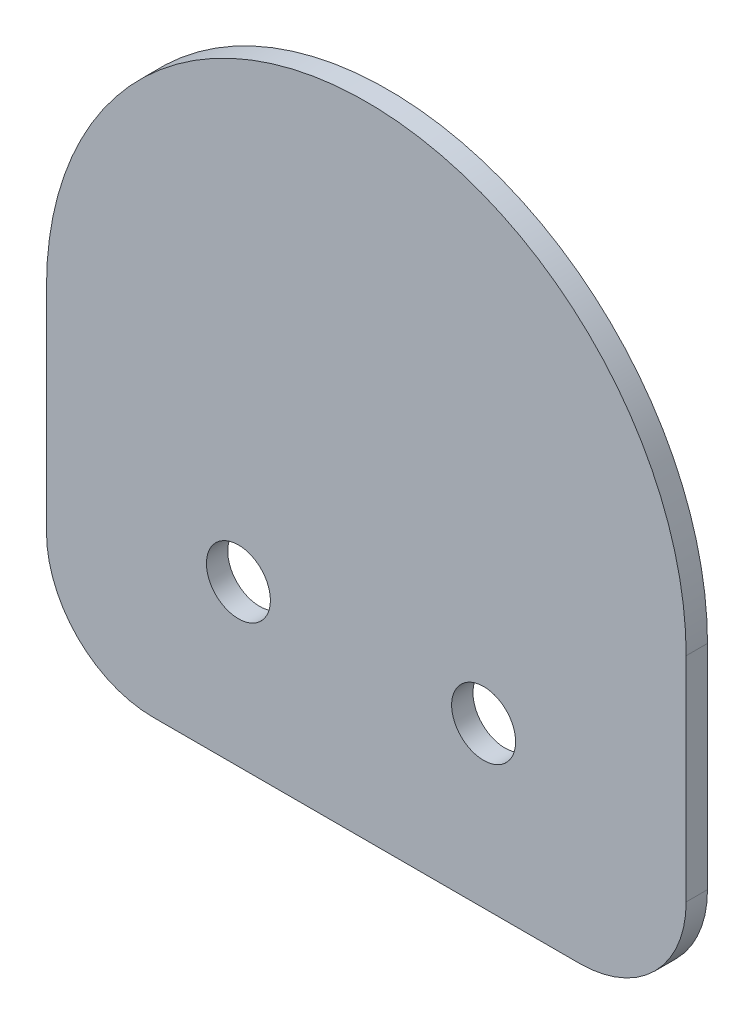
ISO-10303-21;
HEADER;
FILE_DESCRIPTION(('STEP AP214'),'2;1');
FILE_NAME('part.step','',(''),(''),'','','');
FILE_SCHEMA(('AUTOMOTIVE_DESIGN { 1 0 10303 214 1 1 1 1 }'));
ENDSEC;
DATA;
#1=APPLICATION_CONTEXT('core data for automotive mechanical design processes');
#2=APPLICATION_PROTOCOL_DEFINITION('international standard','automotive_design',2000,#1);
#3=PRODUCT_CONTEXT('',#1,'mechanical');
#4=PRODUCT('Part','Part','',(#3));
#5=PRODUCT_RELATED_PRODUCT_CATEGORY('part','',(#4));
#6=PRODUCT_DEFINITION_FORMATION('','',#4);
#7=PRODUCT_DEFINITION_CONTEXT('part definition',#1,'design');
#8=PRODUCT_DEFINITION('design','',#6,#7);
#9=PRODUCT_DEFINITION_SHAPE('','',#8);
#10=(LENGTH_UNIT() NAMED_UNIT(*) SI_UNIT(.MILLI.,.METRE.));
#11=(NAMED_UNIT(*) PLANE_ANGLE_UNIT() SI_UNIT($,.RADIAN.));
#12=(NAMED_UNIT(*) SI_UNIT($,.STERADIAN.) SOLID_ANGLE_UNIT());
#13=UNCERTAINTY_MEASURE_WITH_UNIT(LENGTH_MEASURE(1.E-05),#10,'distance_accuracy_value','');
#14=(GEOMETRIC_REPRESENTATION_CONTEXT(3) GLOBAL_UNCERTAINTY_ASSIGNED_CONTEXT((#13)) GLOBAL_UNIT_ASSIGNED_CONTEXT((#10,
#11,#12)) REPRESENTATION_CONTEXT('',''));
#15=CARTESIAN_POINT('',(0.,0.,0.));
#16=DIRECTION('',(0.,0.,1.));
#17=DIRECTION('',(1.,0.,0.));
#18=AXIS2_PLACEMENT_3D('',#15,#16,#17);
#19=CARTESIAN_POINT('',(-8.77252259502288,63.4877336882506,1.));
#20=DIRECTION('',(0.,0.,-1.));
#21=DIRECTION('',(-1.,0.,0.));
#22=AXIS2_PLACEMENT_3D('',#19,#20,#21);
#23=PLANE('',#22);
#24=CARTESIAN_POINT('',(-14.7725225950229,55.9877336882506,1.));
#25=DIRECTION('',(0.,0.,1.));
#26=DIRECTION('',(1.,0.,0.));
#27=AXIS2_PLACEMENT_3D('',#24,#25,#26);
#28=CIRCLE('',#27,1.5);
#29=CARTESIAN_POINT('',(-13.2725225950229,55.9877336882506,1.));
#30=VERTEX_POINT('',#29);
#31=EDGE_CURVE('E118',#30,#30,#28,.T.);
#32=ORIENTED_EDGE('',*,*,#31,.F.);
#33=EDGE_LOOP('',(#32));
#34=FACE_BOUND('',#33,.T.);
#35=DIRECTION('',(1.,0.,0.));
#36=VECTOR('',#35,1.);
#37=CARTESIAN_POINT('',(-23.7725225950229,48.4877336882506,1.));
#38=LINE('',#37,#36);
#39=CARTESIAN_POINT('',(-18.7725225950229,48.4877336882506,1.));
#40=VERTEX_POINT('',#39);
#41=CARTESIAN_POINT('',(1.22747740497712,48.4877336882506,1.));
#42=VERTEX_POINT('',#41);
#43=EDGE_CURVE('E96',#40,#42,#38,.T.);
#44=ORIENTED_EDGE('',*,*,#43,.T.);
#45=CARTESIAN_POINT('',(1.22747740497712,53.4877336882506,1.));
#46=DIRECTION('',(0.,0.,-1.));
#47=DIRECTION('',(-1.,0.,0.));
#48=AXIS2_PLACEMENT_3D('',#45,#46,#47);
#49=CIRCLE('',#48,5.);
#50=CARTESIAN_POINT('',(6.22747740497712,53.4877336882506,1.));
#51=VERTEX_POINT('',#50);
#52=EDGE_CURVE('E11',#42,#51,#49,.F.);
#53=ORIENTED_EDGE('',*,*,#52,.T.);
#54=DIRECTION('',(0.,1.,0.));
#55=VECTOR('',#54,1.);
#56=CARTESIAN_POINT('',(6.22747740497712,48.4877336882506,1.));
#57=LINE('',#56,#55);
#58=CARTESIAN_POINT('',(6.22747740497712,63.4877336882506,1.));
#59=VERTEX_POINT('',#58);
#60=EDGE_CURVE('E85',#51,#59,#57,.T.);
#61=ORIENTED_EDGE('',*,*,#60,.T.);
#62=CARTESIAN_POINT('',(-8.77252259502288,63.4877336882506,1.));
#63=DIRECTION('',(0.,0.,1.));
#64=DIRECTION('',(-1.,0.,0.));
#65=AXIS2_PLACEMENT_3D('',#62,#63,#64);
#66=CIRCLE('',#65,15.);
#67=CARTESIAN_POINT('',(-23.7725225950229,63.4877336882506,1.));
#68=VERTEX_POINT('',#67);
#69=EDGE_CURVE('E90',#59,#68,#66,.T.);
#70=ORIENTED_EDGE('',*,*,#69,.T.);
#71=DIRECTION('',(0.,-1.,0.));
#72=VECTOR('',#71,1.);
#73=CARTESIAN_POINT('',(-23.7725225950229,48.4877336882506,1.));
#74=LINE('',#73,#72);
#75=CARTESIAN_POINT('',(-23.7725225950229,53.4877336882506,1.));
#76=VERTEX_POINT('',#75);
#77=EDGE_CURVE('E122',#68,#76,#74,.T.);
#78=ORIENTED_EDGE('',*,*,#77,.T.);
#79=CARTESIAN_POINT('',(-18.7725225950229,53.4877336882506,1.));
#80=DIRECTION('',(0.,0.,-1.));
#81=DIRECTION('',(-1.,0.,0.));
#82=AXIS2_PLACEMENT_3D('',#79,#80,#81);
#83=CIRCLE('',#82,5.);
#84=EDGE_CURVE('E130',#76,#40,#83,.F.);
#85=ORIENTED_EDGE('',*,*,#84,.T.);
#86=EDGE_LOOP('',(#44,#53,#61,#70,#78,#85));
#87=FACE_BOUND('',#86,.T.);
#88=CARTESIAN_POINT('',(-3.27252259502288,55.9877336882506,1.));
#89=DIRECTION('',(0.,0.,1.));
#90=DIRECTION('',(1.,0.,0.));
#91=AXIS2_PLACEMENT_3D('',#88,#89,#90);
#92=CIRCLE('',#91,1.5);
#93=CARTESIAN_POINT('',(-1.77252259502288,55.9877336882506,1.));
#94=VERTEX_POINT('',#93);
#95=EDGE_CURVE('E147',#94,#94,#92,.T.);
#96=ORIENTED_EDGE('',*,*,#95,.F.);
#97=EDGE_LOOP('',(#96));
#98=FACE_BOUND('',#97,.T.);
#99=ADVANCED_FACE('F33',(#34,#87,#98),#23,.F.);
#100=CARTESIAN_POINT('',(-8.77252259502288,63.4877336882506,0.));
#101=DIRECTION('',(0.,0.,-1.));
#102=DIRECTION('',(-1.,0.,0.));
#103=AXIS2_PLACEMENT_3D('',#100,#101,#102);
#104=PLANE('',#103);
#105=CARTESIAN_POINT('',(-14.7725225950229,55.9877336882506,0.));
#106=DIRECTION('',(0.,0.,1.));
#107=DIRECTION('',(1.,0.,0.));
#108=AXIS2_PLACEMENT_3D('',#105,#106,#107);
#109=CIRCLE('',#108,1.5);
#110=CARTESIAN_POINT('',(-13.2725225950229,55.9877336882506,0.));
#111=VERTEX_POINT('',#110);
#112=EDGE_CURVE('E144',#111,#111,#109,.T.);
#113=ORIENTED_EDGE('',*,*,#112,.T.);
#114=EDGE_LOOP('',(#113));
#115=FACE_BOUND('',#114,.T.);
#116=DIRECTION('',(0.,1.,0.));
#117=VECTOR('',#116,1.);
#118=CARTESIAN_POINT('',(6.22747740497712,48.4877336882506,0.));
#119=LINE('',#118,#117);
#120=CARTESIAN_POINT('',(6.22747740497712,53.4877336882506,0.));
#121=VERTEX_POINT('',#120);
#122=CARTESIAN_POINT('',(6.22747740497712,63.4877336882506,0.));
#123=VERTEX_POINT('',#122);
#124=EDGE_CURVE('E101',#121,#123,#119,.T.);
#125=ORIENTED_EDGE('',*,*,#124,.F.);
#126=CARTESIAN_POINT('',(1.22747740497712,53.4877336882506,0.));
#127=DIRECTION('',(0.,0.,-1.));
#128=DIRECTION('',(-1.,0.,0.));
#129=AXIS2_PLACEMENT_3D('',#126,#127,#128);
#130=CIRCLE('',#129,5.);
#131=CARTESIAN_POINT('',(1.22747740497712,48.4877336882506,0.));
#132=VERTEX_POINT('',#131);
#133=EDGE_CURVE('E55',#121,#132,#130,.T.);
#134=ORIENTED_EDGE('',*,*,#133,.T.);
#135=DIRECTION('',(1.,0.,0.));
#136=VECTOR('',#135,1.);
#137=CARTESIAN_POINT('',(-23.7725225950229,48.4877336882506,0.));
#138=LINE('',#137,#136);
#139=CARTESIAN_POINT('',(-18.7725225950229,48.4877336882506,0.));
#140=VERTEX_POINT('',#139);
#141=EDGE_CURVE('E117',#140,#132,#138,.T.);
#142=ORIENTED_EDGE('',*,*,#141,.F.);
#143=CARTESIAN_POINT('',(-18.7725225950229,53.4877336882506,0.));
#144=DIRECTION('',(0.,0.,-1.));
#145=DIRECTION('',(-1.,0.,0.));
#146=AXIS2_PLACEMENT_3D('',#143,#144,#145);
#147=CIRCLE('',#146,5.);
#148=CARTESIAN_POINT('',(-23.7725225950229,53.4877336882506,0.));
#149=VERTEX_POINT('',#148);
#150=EDGE_CURVE('E126',#140,#149,#147,.T.);
#151=ORIENTED_EDGE('',*,*,#150,.T.);
#152=DIRECTION('',(0.,-1.,0.));
#153=VECTOR('',#152,1.);
#154=CARTESIAN_POINT('',(-23.7725225950229,48.4877336882506,0.));
#155=LINE('',#154,#153);
#156=CARTESIAN_POINT('',(-23.7725225950229,63.4877336882506,0.));
#157=VERTEX_POINT('',#156);
#158=EDGE_CURVE('E114',#157,#149,#155,.T.);
#159=ORIENTED_EDGE('',*,*,#158,.F.);
#160=CARTESIAN_POINT('',(-8.77252259502288,63.4877336882506,0.));
#161=DIRECTION('',(0.,0.,1.));
#162=DIRECTION('',(-1.,0.,0.));
#163=AXIS2_PLACEMENT_3D('',#160,#161,#162);
#164=CIRCLE('',#163,15.);
#165=EDGE_CURVE('E121',#123,#157,#164,.T.);
#166=ORIENTED_EDGE('',*,*,#165,.F.);
#167=EDGE_LOOP('',(#125,#134,#142,#151,#159,#166));
#168=FACE_BOUND('',#167,.T.);
#169=CARTESIAN_POINT('',(-3.27252259502288,55.9877336882506,0.));
#170=DIRECTION('',(0.,0.,1.));
#171=DIRECTION('',(1.,0.,0.));
#172=AXIS2_PLACEMENT_3D('',#169,#170,#171);
#173=CIRCLE('',#172,1.5);
#174=CARTESIAN_POINT('',(-1.77252259502288,55.9877336882506,0.));
#175=VERTEX_POINT('',#174);
#176=EDGE_CURVE('E150',#175,#175,#173,.T.);
#177=ORIENTED_EDGE('',*,*,#176,.T.);
#178=EDGE_LOOP('',(#177));
#179=FACE_BOUND('',#178,.T.);
#180=ADVANCED_FACE('F135',(#115,#168,#179),#104,.T.);
#181=CARTESIAN_POINT('',(-23.7725225950229,48.4877336882506,1.));
#182=DIRECTION('',(1.,0.,0.));
#183=DIRECTION('',(0.,0.,-1.));
#184=AXIS2_PLACEMENT_3D('',#181,#182,#183);
#185=PLANE('',#184);
#186=ORIENTED_EDGE('',*,*,#158,.T.);
#187=DIRECTION('',(0.,0.,-1.));
#188=VECTOR('',#187,1.);
#189=CARTESIAN_POINT('',(-23.7725225950229,53.4877336882506,1.));
#190=LINE('',#189,#188);
#191=EDGE_CURVE('E128',#149,#76,#190,.F.);
#192=ORIENTED_EDGE('',*,*,#191,.T.);
#193=ORIENTED_EDGE('',*,*,#77,.F.);
#194=DIRECTION('',(0.,0.,-1.));
#195=VECTOR('',#194,1.);
#196=CARTESIAN_POINT('',(-23.7725225950229,63.4877336882506,1.));
#197=LINE('',#196,#195);
#198=EDGE_CURVE('E105',#68,#157,#197,.T.);
#199=ORIENTED_EDGE('',*,*,#198,.T.);
#200=EDGE_LOOP('',(#186,#192,#193,#199));
#201=FACE_BOUND('',#200,.T.);
#202=ADVANCED_FACE('F139',(#201),#185,.F.);
#203=CARTESIAN_POINT('',(-23.7725225950229,48.4877336882506,1.));
#204=DIRECTION('',(0.,1.,0.));
#205=DIRECTION('',(0.,0.,1.));
#206=AXIS2_PLACEMENT_3D('',#203,#204,#205);
#207=PLANE('',#206);
#208=ORIENTED_EDGE('',*,*,#141,.T.);
#209=DIRECTION('',(0.,0.,-1.));
#210=VECTOR('',#209,1.);
#211=CARTESIAN_POINT('',(1.22747740497712,48.4877336882506,1.));
#212=LINE('',#211,#210);
#213=EDGE_CURVE('E41',#132,#42,#212,.F.);
#214=ORIENTED_EDGE('',*,*,#213,.T.);
#215=ORIENTED_EDGE('',*,*,#43,.F.);
#216=DIRECTION('',(0.,0.,-1.));
#217=VECTOR('',#216,1.);
#218=CARTESIAN_POINT('',(-18.7725225950229,48.4877336882506,1.));
#219=LINE('',#218,#217);
#220=EDGE_CURVE('E104',#40,#140,#219,.T.);
#221=ORIENTED_EDGE('',*,*,#220,.T.);
#222=EDGE_LOOP('',(#208,#214,#215,#221));
#223=FACE_BOUND('',#222,.T.);
#224=ADVANCED_FACE('F175',(#223),#207,.F.);
#225=CARTESIAN_POINT('',(6.22747740497712,48.4877336882506,1.));
#226=DIRECTION('',(-1.,0.,0.));
#227=DIRECTION('',(0.,0.,1.));
#228=AXIS2_PLACEMENT_3D('',#225,#226,#227);
#229=PLANE('',#228);
#230=ORIENTED_EDGE('',*,*,#60,.F.);
#231=DIRECTION('',(0.,0.,-1.));
#232=VECTOR('',#231,1.);
#233=CARTESIAN_POINT('',(6.22747740497712,53.4877336882506,1.));
#234=LINE('',#233,#232);
#235=EDGE_CURVE('E132',#51,#121,#234,.T.);
#236=ORIENTED_EDGE('',*,*,#235,.T.);
#237=ORIENTED_EDGE('',*,*,#124,.T.);
#238=DIRECTION('',(0.,0.,-1.));
#239=VECTOR('',#238,1.);
#240=CARTESIAN_POINT('',(6.22747740497712,63.4877336882506,1.));
#241=LINE('',#240,#239);
#242=EDGE_CURVE('E99',#59,#123,#241,.T.);
#243=ORIENTED_EDGE('',*,*,#242,.F.);
#244=EDGE_LOOP('',(#230,#236,#237,#243));
#245=FACE_BOUND('',#244,.T.);
#246=ADVANCED_FACE('F100',(#245),#229,.F.);
#247=CARTESIAN_POINT('',(-8.77252259502288,63.4877336882506,1.));
#248=DIRECTION('',(0.,0.,-1.));
#249=DIRECTION('',(-1.,0.,0.));
#250=AXIS2_PLACEMENT_3D('',#247,#248,#249);
#251=CYLINDRICAL_SURFACE('',#250,15.);
#252=ORIENTED_EDGE('',*,*,#165,.T.);
#253=ORIENTED_EDGE('',*,*,#198,.F.);
#254=ORIENTED_EDGE('',*,*,#69,.F.);
#255=ORIENTED_EDGE('',*,*,#242,.T.);
#256=EDGE_LOOP('',(#252,#253,#254,#255));
#257=FACE_BOUND('',#256,.T.);
#258=ADVANCED_FACE('F107',(#257),#251,.T.);
#259=CARTESIAN_POINT('',(-14.7725225950229,55.9877336882506,1.));
#260=DIRECTION('',(0.,0.,-1.));
#261=DIRECTION('',(-1.,0.,0.));
#262=AXIS2_PLACEMENT_3D('',#259,#260,#261);
#263=CYLINDRICAL_SURFACE('',#262,1.5);
#264=ORIENTED_EDGE('',*,*,#31,.T.);
#265=EDGE_LOOP('',(#264));
#266=FACE_BOUND('',#265,.T.);
#267=ORIENTED_EDGE('',*,*,#112,.F.);
#268=EDGE_LOOP('',(#267));
#269=FACE_BOUND('',#268,.T.);
#270=ADVANCED_FACE('F168',(#266,#269),#263,.F.);
#271=CARTESIAN_POINT('',(-3.27252259502288,55.9877336882506,1.));
#272=DIRECTION('',(0.,0.,-1.));
#273=DIRECTION('',(-1.,0.,0.));
#274=AXIS2_PLACEMENT_3D('',#271,#272,#273);
#275=CYLINDRICAL_SURFACE('',#274,1.5);
#276=ORIENTED_EDGE('',*,*,#95,.T.);
#277=EDGE_LOOP('',(#276));
#278=FACE_BOUND('',#277,.T.);
#279=ORIENTED_EDGE('',*,*,#176,.F.);
#280=EDGE_LOOP('',(#279));
#281=FACE_BOUND('',#280,.T.);
#282=ADVANCED_FACE('F156',(#278,#281),#275,.F.);
#283=CARTESIAN_POINT('',(-18.7725225950229,53.4877336882506,1.));
#284=DIRECTION('',(0.,0.,-1.));
#285=DIRECTION('',(-1.,0.,0.));
#286=AXIS2_PLACEMENT_3D('',#283,#284,#285);
#287=CYLINDRICAL_SURFACE('',#286,5.);
#288=ORIENTED_EDGE('',*,*,#84,.F.);
#289=ORIENTED_EDGE('',*,*,#191,.F.);
#290=ORIENTED_EDGE('',*,*,#150,.F.);
#291=ORIENTED_EDGE('',*,*,#220,.F.);
#292=EDGE_LOOP('',(#288,#289,#290,#291));
#293=FACE_BOUND('',#292,.T.);
#294=ADVANCED_FACE('F179',(#293),#287,.T.);
#295=CARTESIAN_POINT('',(1.22747740497712,53.4877336882506,1.));
#296=DIRECTION('',(0.,0.,-1.));
#297=DIRECTION('',(-1.,0.,0.));
#298=AXIS2_PLACEMENT_3D('',#295,#296,#297);
#299=CYLINDRICAL_SURFACE('',#298,5.);
#300=ORIENTED_EDGE('',*,*,#52,.F.);
#301=ORIENTED_EDGE('',*,*,#213,.F.);
#302=ORIENTED_EDGE('',*,*,#133,.F.);
#303=ORIENTED_EDGE('',*,*,#235,.F.);
#304=EDGE_LOOP('',(#300,#301,#302,#303));
#305=FACE_BOUND('',#304,.T.);
#306=ADVANCED_FACE('F35',(#305),#299,.T.);
#307=CLOSED_SHELL('',(#99,#180,#202,#224,#246,#258,#270,#282,#294,#306));
#308=MANIFOLD_SOLID_BREP('B2',#307);
#309=ADVANCED_BREP_SHAPE_REPRESENTATION('',(#18,#308),#14);
#310=SHAPE_DEFINITION_REPRESENTATION(#9,#309);
ENDSEC;
END-ISO-10303-21;
